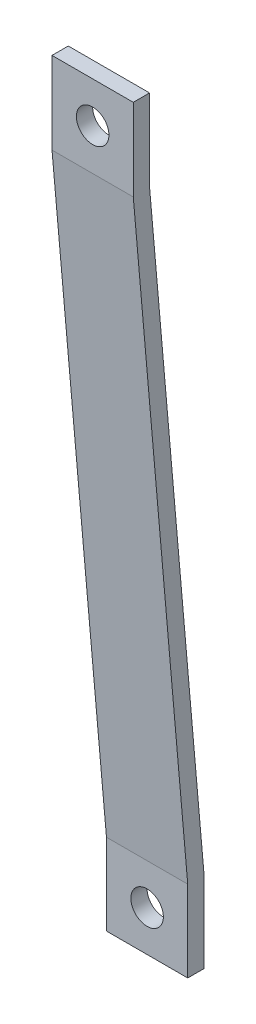
ISO-10303-21;
HEADER;
FILE_DESCRIPTION(('STEP AP214'),'2;1');
FILE_NAME('part.step','',(''),(''),'','','');
FILE_SCHEMA(('AUTOMOTIVE_DESIGN { 1 0 10303 214 1 1 1 1 }'));
ENDSEC;
DATA;
#1=APPLICATION_CONTEXT('core data for automotive mechanical design processes');
#2=APPLICATION_PROTOCOL_DEFINITION('international standard','automotive_design',2000,#1);
#3=PRODUCT_CONTEXT('',#1,'mechanical');
#4=PRODUCT('Part','Part','',(#3));
#5=PRODUCT_RELATED_PRODUCT_CATEGORY('part','',(#4));
#6=PRODUCT_DEFINITION_FORMATION('','',#4);
#7=PRODUCT_DEFINITION_CONTEXT('part definition',#1,'design');
#8=PRODUCT_DEFINITION('design','',#6,#7);
#9=PRODUCT_DEFINITION_SHAPE('','',#8);
#10=(LENGTH_UNIT() NAMED_UNIT(*) SI_UNIT(.MILLI.,.METRE.));
#11=(NAMED_UNIT(*) PLANE_ANGLE_UNIT() SI_UNIT($,.RADIAN.));
#12=(NAMED_UNIT(*) SI_UNIT($,.STERADIAN.) SOLID_ANGLE_UNIT());
#13=UNCERTAINTY_MEASURE_WITH_UNIT(LENGTH_MEASURE(1.E-05),#10,'distance_accuracy_value','');
#14=(GEOMETRIC_REPRESENTATION_CONTEXT(3) GLOBAL_UNCERTAINTY_ASSIGNED_CONTEXT((#13)) GLOBAL_UNIT_ASSIGNED_CONTEXT((#10,
#11,#12)) REPRESENTATION_CONTEXT('',''));
#15=CARTESIAN_POINT('',(0.,0.,0.));
#16=DIRECTION('',(0.,0.,1.));
#17=DIRECTION('',(1.,0.,0.));
#18=AXIS2_PLACEMENT_3D('',#15,#16,#17);
#19=CARTESIAN_POINT('',(15.,0.,3.));
#20=DIRECTION('',(0.,1.,0.));
#21=DIRECTION('',(0.,0.,1.));
#22=AXIS2_PLACEMENT_3D('',#19,#20,#21);
#23=PLANE('',#22);
#24=DIRECTION('',(0.,0.,-1.));
#25=VECTOR('',#24,1.);
#26=CARTESIAN_POINT('',(0.,0.,3.));
#27=LINE('',#26,#25);
#28=CARTESIAN_POINT('',(0.,0.,3.));
#29=VERTEX_POINT('',#28);
#30=CARTESIAN_POINT('',(0.,0.,0.));
#31=VERTEX_POINT('',#30);
#32=EDGE_CURVE('E129',#29,#31,#27,.T.);
#33=ORIENTED_EDGE('',*,*,#32,.T.);
#34=DIRECTION('',(-1.,0.,0.));
#35=VECTOR('',#34,1.);
#36=CARTESIAN_POINT('',(15.,0.,0.));
#37=LINE('',#36,#35);
#38=CARTESIAN_POINT('',(15.,0.,0.));
#39=VERTEX_POINT('',#38);
#40=EDGE_CURVE('E11',#39,#31,#37,.T.);
#41=ORIENTED_EDGE('',*,*,#40,.F.);
#42=DIRECTION('',(0.,0.,-1.));
#43=VECTOR('',#42,1.);
#44=CARTESIAN_POINT('',(15.,0.,3.));
#45=LINE('',#44,#43);
#46=CARTESIAN_POINT('',(15.,0.,3.));
#47=VERTEX_POINT('',#46);
#48=EDGE_CURVE('E144',#47,#39,#45,.T.);
#49=ORIENTED_EDGE('',*,*,#48,.F.);
#50=DIRECTION('',(-1.,0.,0.));
#51=VECTOR('',#50,1.);
#52=CARTESIAN_POINT('',(15.,0.,3.));
#53=LINE('',#52,#51);
#54=EDGE_CURVE('E125',#47,#29,#53,.T.);
#55=ORIENTED_EDGE('',*,*,#54,.T.);
#56=EDGE_LOOP('',(#33,#41,#49,#55));
#57=FACE_BOUND('',#56,.T.);
#58=ADVANCED_FACE('F33',(#57),#23,.F.);
#59=CARTESIAN_POINT('',(15.,15.1309828287255,0.));
#60=DIRECTION('',(0.,0.,1.));
#61=DIRECTION('',(0.,-1.,0.));
#62=AXIS2_PLACEMENT_3D('',#59,#60,#61);
#63=PLANE('',#62);
#64=CARTESIAN_POINT('',(7.5,7.5,0.));
#65=DIRECTION('',(0.,0.,1.));
#66=DIRECTION('',(0.,-1.,0.));
#67=AXIS2_PLACEMENT_3D('',#64,#65,#66);
#68=CIRCLE('',#67,3.);
#69=CARTESIAN_POINT('',(7.5,4.5,0.));
#70=VERTEX_POINT('',#69);
#71=EDGE_CURVE('E133',#70,#70,#68,.F.);
#72=ORIENTED_EDGE('',*,*,#71,.F.);
#73=EDGE_LOOP('',(#72));
#74=FACE_BOUND('',#73,.T.);
#75=DIRECTION('',(0.,1.,0.));
#76=VECTOR('',#75,1.);
#77=CARTESIAN_POINT('',(0.,15.1309828287255,0.));
#78=LINE('',#77,#76);
#79=CARTESIAN_POINT('',(0.,15.1309828287255,0.));
#80=VERTEX_POINT('',#79);
#81=EDGE_CURVE('E132',#31,#80,#78,.T.);
#82=ORIENTED_EDGE('',*,*,#81,.T.);
#83=DIRECTION('',(-1.,0.,0.));
#84=VECTOR('',#83,1.);
#85=CARTESIAN_POINT('',(15.,15.1309828287255,0.));
#86=LINE('',#85,#84);
#87=CARTESIAN_POINT('',(15.,15.1309828287255,0.));
#88=VERTEX_POINT('',#87);
#89=EDGE_CURVE('E41',#88,#80,#86,.T.);
#90=ORIENTED_EDGE('',*,*,#89,.F.);
#91=DIRECTION('',(0.,1.,0.));
#92=VECTOR('',#91,1.);
#93=CARTESIAN_POINT('',(15.,15.1309828287255,0.));
#94=LINE('',#93,#92);
#95=EDGE_CURVE('E92',#39,#88,#94,.T.);
#96=ORIENTED_EDGE('',*,*,#95,.F.);
#97=ORIENTED_EDGE('',*,*,#40,.T.);
#98=EDGE_LOOP('',(#82,#90,#96,#97));
#99=FACE_BOUND('',#98,.T.);
#100=ADVANCED_FACE('F201',(#74,#99),#63,.F.);
#101=CARTESIAN_POINT('',(15.,130.,10.0497367928504));
#102=DIRECTION('',(0.,-0.0871557427476515,0.996194698091746));
#103=DIRECTION('',(0.,-0.996194698091746,-0.0871557427476515));
#104=AXIS2_PLACEMENT_3D('',#101,#102,#103);
#105=PLANE('',#104);
#106=DIRECTION('',(0.,0.996194698091746,0.0871557427476515));
#107=VECTOR('',#106,1.);
#108=CARTESIAN_POINT('',(0.,130.,10.0497367928504));
#109=LINE('',#108,#107);
#110=CARTESIAN_POINT('',(0.,130.,10.0497367928504));
#111=VERTEX_POINT('',#110);
#112=EDGE_CURVE('E135',#80,#111,#109,.T.);
#113=ORIENTED_EDGE('',*,*,#112,.T.);
#114=DIRECTION('',(-1.,0.,0.));
#115=VECTOR('',#114,1.);
#116=CARTESIAN_POINT('',(15.,130.,10.0497367928504));
#117=LINE('',#116,#115);
#118=CARTESIAN_POINT('',(15.,130.,10.0497367928504));
#119=VERTEX_POINT('',#118);
#120=EDGE_CURVE('E151',#119,#111,#117,.T.);
#121=ORIENTED_EDGE('',*,*,#120,.F.);
#122=DIRECTION('',(0.,0.996194698091746,0.0871557427476515));
#123=VECTOR('',#122,1.);
#124=CARTESIAN_POINT('',(15.,130.,10.0497367928504));
#125=LINE('',#124,#123);
#126=EDGE_CURVE('E159',#88,#119,#125,.T.);
#127=ORIENTED_EDGE('',*,*,#126,.F.);
#128=ORIENTED_EDGE('',*,*,#89,.T.);
#129=EDGE_LOOP('',(#113,#121,#127,#128));
#130=FACE_BOUND('',#129,.T.);
#131=ADVANCED_FACE('F157',(#130),#105,.F.);
#132=CARTESIAN_POINT('',(15.,145.,10.0497367928504));
#133=DIRECTION('',(0.,0.,1.));
#134=DIRECTION('',(1.,0.,0.));
#135=AXIS2_PLACEMENT_3D('',#132,#133,#134);
#136=PLANE('',#135);
#137=CARTESIAN_POINT('',(7.5,137.5,10.0497367928504));
#138=DIRECTION('',(0.,0.,1.));
#139=DIRECTION('',(1.,0.,0.));
#140=AXIS2_PLACEMENT_3D('',#137,#138,#139);
#141=CIRCLE('',#140,3.);
#142=CARTESIAN_POINT('',(10.5,137.5,10.0497367928504));
#143=VERTEX_POINT('',#142);
#144=EDGE_CURVE('E182',#143,#143,#141,.F.);
#145=ORIENTED_EDGE('',*,*,#144,.F.);
#146=EDGE_LOOP('',(#145));
#147=FACE_BOUND('',#146,.T.);
#148=DIRECTION('',(0.,1.,0.));
#149=VECTOR('',#148,1.);
#150=CARTESIAN_POINT('',(0.,145.,10.0497367928504));
#151=LINE('',#150,#149);
#152=CARTESIAN_POINT('',(0.,145.,10.0497367928504));
#153=VERTEX_POINT('',#152);
#154=EDGE_CURVE('E137',#111,#153,#151,.T.);
#155=ORIENTED_EDGE('',*,*,#154,.T.);
#156=DIRECTION('',(-1.,0.,0.));
#157=VECTOR('',#156,1.);
#158=CARTESIAN_POINT('',(15.,145.,10.0497367928504));
#159=LINE('',#158,#157);
#160=CARTESIAN_POINT('',(15.,145.,10.0497367928504));
#161=VERTEX_POINT('',#160);
#162=EDGE_CURVE('E148',#161,#153,#159,.T.);
#163=ORIENTED_EDGE('',*,*,#162,.F.);
#164=DIRECTION('',(0.,1.,0.));
#165=VECTOR('',#164,1.);
#166=CARTESIAN_POINT('',(15.,145.,10.0497367928504));
#167=LINE('',#166,#165);
#168=EDGE_CURVE('E171',#119,#161,#167,.T.);
#169=ORIENTED_EDGE('',*,*,#168,.F.);
#170=ORIENTED_EDGE('',*,*,#120,.T.);
#171=EDGE_LOOP('',(#155,#163,#169,#170));
#172=FACE_BOUND('',#171,.T.);
#173=ADVANCED_FACE('F167',(#147,#172),#136,.F.);
#174=CARTESIAN_POINT('',(15.,145.,13.0497367928504));
#175=DIRECTION('',(0.,-1.,0.));
#176=DIRECTION('',(0.,0.,-1.));
#177=AXIS2_PLACEMENT_3D('',#174,#175,#176);
#178=PLANE('',#177);
#179=DIRECTION('',(0.,0.,1.));
#180=VECTOR('',#179,1.);
#181=CARTESIAN_POINT('',(0.,145.,13.0497367928504));
#182=LINE('',#181,#180);
#183=CARTESIAN_POINT('',(0.,145.,13.0497367928504));
#184=VERTEX_POINT('',#183);
#185=EDGE_CURVE('E139',#153,#184,#182,.T.);
#186=ORIENTED_EDGE('',*,*,#185,.T.);
#187=DIRECTION('',(-1.,0.,0.));
#188=VECTOR('',#187,1.);
#189=CARTESIAN_POINT('',(15.,145.,13.0497367928504));
#190=LINE('',#189,#188);
#191=CARTESIAN_POINT('',(15.,145.,13.0497367928504));
#192=VERTEX_POINT('',#191);
#193=EDGE_CURVE('E120',#192,#184,#190,.T.);
#194=ORIENTED_EDGE('',*,*,#193,.F.);
#195=DIRECTION('',(0.,0.,1.));
#196=VECTOR('',#195,1.);
#197=CARTESIAN_POINT('',(15.,145.,13.0497367928504));
#198=LINE('',#197,#196);
#199=EDGE_CURVE('E111',#161,#192,#198,.T.);
#200=ORIENTED_EDGE('',*,*,#199,.F.);
#201=ORIENTED_EDGE('',*,*,#162,.T.);
#202=EDGE_LOOP('',(#186,#194,#200,#201));
#203=FACE_BOUND('',#202,.T.);
#204=ADVANCED_FACE('F170',(#203),#178,.F.);
#205=CARTESIAN_POINT('',(15.,145.,13.0497367928504));
#206=DIRECTION('',(0.,0.,-1.));
#207=DIRECTION('',(0.,1.,0.));
#208=AXIS2_PLACEMENT_3D('',#205,#206,#207);
#209=PLANE('',#208);
#210=CARTESIAN_POINT('',(7.5,137.5,13.0497367928504));
#211=DIRECTION('',(0.,0.,1.));
#212=DIRECTION('',(1.,0.,0.));
#213=AXIS2_PLACEMENT_3D('',#210,#211,#212);
#214=CIRCLE('',#213,3.);
#215=CARTESIAN_POINT('',(10.5,137.5,13.0497367928504));
#216=VERTEX_POINT('',#215);
#217=EDGE_CURVE('E185',#216,#216,#214,.T.);
#218=ORIENTED_EDGE('',*,*,#217,.F.);
#219=EDGE_LOOP('',(#218));
#220=FACE_BOUND('',#219,.T.);
#221=DIRECTION('',(0.,-1.,0.));
#222=VECTOR('',#221,1.);
#223=CARTESIAN_POINT('',(0.,145.,13.0497367928504));
#224=LINE('',#223,#222);
#225=CARTESIAN_POINT('',(0.,129.869017171274,13.0497367928504));
#226=VERTEX_POINT('',#225);
#227=EDGE_CURVE('E119',#184,#226,#224,.T.);
#228=ORIENTED_EDGE('',*,*,#227,.T.);
#229=DIRECTION('',(-1.,0.,0.));
#230=VECTOR('',#229,1.);
#231=CARTESIAN_POINT('',(15.,129.869017171274,13.0497367928504));
#232=LINE('',#231,#230);
#233=CARTESIAN_POINT('',(15.,129.869017171274,13.0497367928504));
#234=VERTEX_POINT('',#233);
#235=EDGE_CURVE('E116',#234,#226,#232,.T.);
#236=ORIENTED_EDGE('',*,*,#235,.F.);
#237=DIRECTION('',(0.,-1.,0.));
#238=VECTOR('',#237,1.);
#239=CARTESIAN_POINT('',(15.,145.,13.0497367928504));
#240=LINE('',#239,#238);
#241=EDGE_CURVE('E105',#192,#234,#240,.T.);
#242=ORIENTED_EDGE('',*,*,#241,.F.);
#243=ORIENTED_EDGE('',*,*,#193,.T.);
#244=EDGE_LOOP('',(#228,#236,#242,#243));
#245=FACE_BOUND('',#244,.T.);
#246=ADVANCED_FACE('F117',(#220,#245),#209,.F.);
#247=CARTESIAN_POINT('',(15.,129.869017171274,13.0497367928504));
#248=DIRECTION('',(0.,0.0871557427476515,-0.996194698091746));
#249=DIRECTION('',(0.,0.996194698091746,0.0871557427476515));
#250=AXIS2_PLACEMENT_3D('',#247,#248,#249);
#251=PLANE('',#250);
#252=DIRECTION('',(0.,-0.996194698091746,-0.0871557427476515));
#253=VECTOR('',#252,1.);
#254=CARTESIAN_POINT('',(0.,129.869017171274,13.0497367928504));
#255=LINE('',#254,#253);
#256=CARTESIAN_POINT('',(0.,15.,3.));
#257=VERTEX_POINT('',#256);
#258=EDGE_CURVE('E78',#226,#257,#255,.T.);
#259=ORIENTED_EDGE('',*,*,#258,.T.);
#260=DIRECTION('',(-1.,0.,0.));
#261=VECTOR('',#260,1.);
#262=CARTESIAN_POINT('',(15.,15.,3.));
#263=LINE('',#262,#261);
#264=CARTESIAN_POINT('',(15.,15.,3.));
#265=VERTEX_POINT('',#264);
#266=EDGE_CURVE('E121',#265,#257,#263,.T.);
#267=ORIENTED_EDGE('',*,*,#266,.F.);
#268=DIRECTION('',(0.,-0.996194698091746,-0.0871557427476515));
#269=VECTOR('',#268,1.);
#270=CARTESIAN_POINT('',(15.,129.869017171274,13.0497367928504));
#271=LINE('',#270,#269);
#272=EDGE_CURVE('E109',#234,#265,#271,.T.);
#273=ORIENTED_EDGE('',*,*,#272,.F.);
#274=ORIENTED_EDGE('',*,*,#235,.T.);
#275=EDGE_LOOP('',(#259,#267,#273,#274));
#276=FACE_BOUND('',#275,.T.);
#277=ADVANCED_FACE('F123',(#276),#251,.F.);
#278=CARTESIAN_POINT('',(15.,15.,3.));
#279=DIRECTION('',(0.,0.,-1.));
#280=DIRECTION('',(0.,1.,0.));
#281=AXIS2_PLACEMENT_3D('',#278,#279,#280);
#282=PLANE('',#281);
#283=CARTESIAN_POINT('',(7.5,7.5,3.));
#284=DIRECTION('',(0.,0.,1.));
#285=DIRECTION('',(1.,0.,0.));
#286=AXIS2_PLACEMENT_3D('',#283,#284,#285);
#287=CIRCLE('',#286,3.);
#288=CARTESIAN_POINT('',(10.5,7.5,3.));
#289=VERTEX_POINT('',#288);
#290=EDGE_CURVE('E179',#289,#289,#287,.T.);
#291=ORIENTED_EDGE('',*,*,#290,.F.);
#292=EDGE_LOOP('',(#291));
#293=FACE_BOUND('',#292,.T.);
#294=DIRECTION('',(0.,-1.,0.));
#295=VECTOR('',#294,1.);
#296=CARTESIAN_POINT('',(0.,15.,3.));
#297=LINE('',#296,#295);
#298=EDGE_CURVE('E84',#257,#29,#297,.T.);
#299=ORIENTED_EDGE('',*,*,#298,.T.);
#300=ORIENTED_EDGE('',*,*,#54,.F.);
#301=DIRECTION('',(0.,-1.,0.));
#302=VECTOR('',#301,1.);
#303=CARTESIAN_POINT('',(15.,15.,3.));
#304=LINE('',#303,#302);
#305=EDGE_CURVE('E49',#265,#47,#304,.T.);
#306=ORIENTED_EDGE('',*,*,#305,.F.);
#307=ORIENTED_EDGE('',*,*,#266,.T.);
#308=EDGE_LOOP('',(#299,#300,#306,#307));
#309=FACE_BOUND('',#308,.T.);
#310=ADVANCED_FACE('F197',(#293,#309),#282,.F.);
#311=CARTESIAN_POINT('',(15.,0.,0.));
#312=DIRECTION('',(-1.,0.,0.));
#313=DIRECTION('',(0.,0.,1.));
#314=AXIS2_PLACEMENT_3D('',#311,#312,#313);
#315=PLANE('',#314);
#316=ORIENTED_EDGE('',*,*,#48,.T.);
#317=ORIENTED_EDGE('',*,*,#95,.T.);
#318=ORIENTED_EDGE('',*,*,#126,.T.);
#319=ORIENTED_EDGE('',*,*,#168,.T.);
#320=ORIENTED_EDGE('',*,*,#199,.T.);
#321=ORIENTED_EDGE('',*,*,#241,.T.);
#322=ORIENTED_EDGE('',*,*,#272,.T.);
#323=ORIENTED_EDGE('',*,*,#305,.T.);
#324=EDGE_LOOP('',(#316,#317,#318,#319,#320,#321,#322,#323));
#325=FACE_BOUND('',#324,.T.);
#326=ADVANCED_FACE('F107',(#325),#315,.F.);
#327=CARTESIAN_POINT('',(0.,0.,0.));
#328=DIRECTION('',(-1.,0.,0.));
#329=DIRECTION('',(0.,0.,1.));
#330=AXIS2_PLACEMENT_3D('',#327,#328,#329);
#331=PLANE('',#330);
#332=ORIENTED_EDGE('',*,*,#32,.F.);
#333=ORIENTED_EDGE('',*,*,#298,.F.);
#334=ORIENTED_EDGE('',*,*,#258,.F.);
#335=ORIENTED_EDGE('',*,*,#227,.F.);
#336=ORIENTED_EDGE('',*,*,#185,.F.);
#337=ORIENTED_EDGE('',*,*,#154,.F.);
#338=ORIENTED_EDGE('',*,*,#112,.F.);
#339=ORIENTED_EDGE('',*,*,#81,.F.);
#340=EDGE_LOOP('',(#332,#333,#334,#335,#336,#337,#338,#339));
#341=FACE_BOUND('',#340,.T.);
#342=ADVANCED_FACE('F163',(#341),#331,.T.);
#343=CARTESIAN_POINT('',(7.5,7.5,-8.48528137423857));
#344=DIRECTION('',(0.,0.,1.));
#345=DIRECTION('',(1.,0.,0.));
#346=AXIS2_PLACEMENT_3D('',#343,#344,#345);
#347=CYLINDRICAL_SURFACE('',#346,3.);
#348=ORIENTED_EDGE('',*,*,#71,.T.);
#349=EDGE_LOOP('',(#348));
#350=FACE_BOUND('',#349,.T.);
#351=ORIENTED_EDGE('',*,*,#290,.T.);
#352=EDGE_LOOP('',(#351));
#353=FACE_BOUND('',#352,.T.);
#354=ADVANCED_FACE('F219',(#350,#353),#347,.F.);
#355=CARTESIAN_POINT('',(7.5,137.5,1.56445541861187));
#356=DIRECTION('',(0.,0.,1.));
#357=DIRECTION('',(1.,0.,0.));
#358=AXIS2_PLACEMENT_3D('',#355,#356,#357);
#359=CYLINDRICAL_SURFACE('',#358,3.);
#360=CARTESIAN_POINT('',(10.5,137.5,10.0497367928504));
#361=CARTESIAN_POINT('',(10.5,137.5,10.0809867928504));
#362=CARTESIAN_POINT('',(10.5,137.5,10.1122367928504));
#363=CARTESIAN_POINT('',(10.5,137.5,10.1747367928504));
#364=CARTESIAN_POINT('',(10.5,137.5,10.2059867928504));
#365=CARTESIAN_POINT('',(10.5,137.5,10.2684867928504));
#366=CARTESIAN_POINT('',(10.5,137.5,10.2997367928504));
#367=CARTESIAN_POINT('',(10.5,137.5,10.3622367928504));
#368=CARTESIAN_POINT('',(10.5,137.5,10.3934867928504));
#369=CARTESIAN_POINT('',(10.5,137.5,10.4559867928504));
#370=CARTESIAN_POINT('',(10.5,137.5,10.4872367928504));
#371=CARTESIAN_POINT('',(10.5,137.5,10.5497367928504));
#372=CARTESIAN_POINT('',(10.5,137.5,10.5809867928504));
#373=CARTESIAN_POINT('',(10.5,137.5,10.6434867928504));
#374=CARTESIAN_POINT('',(10.5,137.5,10.6747367928504));
#375=CARTESIAN_POINT('',(10.5,137.5,10.7372367928504));
#376=CARTESIAN_POINT('',(10.5,137.5,10.7684867928504));
#377=CARTESIAN_POINT('',(10.5,137.5,10.8309867928504));
#378=CARTESIAN_POINT('',(10.5,137.5,10.8622367928504));
#379=CARTESIAN_POINT('',(10.5,137.5,10.9247367928504));
#380=CARTESIAN_POINT('',(10.5,137.5,10.9559867928504));
#381=CARTESIAN_POINT('',(10.5,137.5,11.0184867928504));
#382=CARTESIAN_POINT('',(10.5,137.5,11.0497367928504));
#383=CARTESIAN_POINT('',(10.5,137.5,11.1122367928504));
#384=CARTESIAN_POINT('',(10.5,137.5,11.1434867928504));
#385=CARTESIAN_POINT('',(10.5,137.5,11.2059867928504));
#386=CARTESIAN_POINT('',(10.5,137.5,11.2372367928504));
#387=CARTESIAN_POINT('',(10.5,137.5,11.2997367928504));
#388=CARTESIAN_POINT('',(10.5,137.5,11.3309867928504));
#389=CARTESIAN_POINT('',(10.5,137.5,11.3934867928504));
#390=CARTESIAN_POINT('',(10.5,137.5,11.4247367928504));
#391=CARTESIAN_POINT('',(10.5,137.5,11.4872367928504));
#392=CARTESIAN_POINT('',(10.5,137.5,11.5184867928504));
#393=CARTESIAN_POINT('',(10.5,137.5,11.5809867928504));
#394=CARTESIAN_POINT('',(10.5,137.5,11.6122367928504));
#395=CARTESIAN_POINT('',(10.5,137.5,11.6747367928504));
#396=CARTESIAN_POINT('',(10.5,137.5,11.7059867928504));
#397=CARTESIAN_POINT('',(10.5,137.5,11.7684867928504));
#398=CARTESIAN_POINT('',(10.5,137.5,11.7997367928504));
#399=CARTESIAN_POINT('',(10.5,137.5,11.8622367928504));
#400=CARTESIAN_POINT('',(10.5,137.5,11.8934867928504));
#401=CARTESIAN_POINT('',(10.5,137.5,11.9559867928504));
#402=CARTESIAN_POINT('',(10.5,137.5,11.9872367928504));
#403=CARTESIAN_POINT('',(10.5,137.5,12.0497367928504));
#404=CARTESIAN_POINT('',(10.5,137.5,12.0809867928504));
#405=CARTESIAN_POINT('',(10.5,137.5,12.1434867928504));
#406=CARTESIAN_POINT('',(10.5,137.5,12.1747367928504));
#407=CARTESIAN_POINT('',(10.5,137.5,12.2372367928504));
#408=CARTESIAN_POINT('',(10.5,137.5,12.2684867928504));
#409=CARTESIAN_POINT('',(10.5,137.5,12.3309867928504));
#410=CARTESIAN_POINT('',(10.5,137.5,12.3622367928504));
#411=CARTESIAN_POINT('',(10.5,137.5,12.4247367928504));
#412=CARTESIAN_POINT('',(10.5,137.5,12.4559867928504));
#413=CARTESIAN_POINT('',(10.5,137.5,12.5184867928504));
#414=CARTESIAN_POINT('',(10.5,137.5,12.5497367928504));
#415=CARTESIAN_POINT('',(10.5,137.5,12.6122367928504));
#416=CARTESIAN_POINT('',(10.5,137.5,12.6434867928504));
#417=CARTESIAN_POINT('',(10.5,137.5,12.7059867928504));
#418=CARTESIAN_POINT('',(10.5,137.5,12.7372367928504));
#419=CARTESIAN_POINT('',(10.5,137.5,12.7997367928504));
#420=CARTESIAN_POINT('',(10.5,137.5,12.8309867928504));
#421=CARTESIAN_POINT('',(10.5,137.5,12.8934867928504));
#422=CARTESIAN_POINT('',(10.5,137.5,12.9247367928504));
#423=CARTESIAN_POINT('',(10.5,137.5,12.9872367928504));
#424=CARTESIAN_POINT('',(10.5,137.5,13.0184867928504));
#425=CARTESIAN_POINT('',(10.5,137.5,13.0497367928504));
#426=B_SPLINE_CURVE_WITH_KNOTS('',3,(#360,#361,#362,#363,#364,#365,#366,#367,#368,#369,#370,
#371,#372,#373,#374,#375,#376,#377,#378,#379,#380,#381,#382,#383,#384,#385,#386,#387,#388,#389,
#390,#391,#392,#393,#394,#395,#396,#397,#398,#399,#400,#401,#402,#403,#404,#405,#406,#407,#408,
#409,#410,#411,#412,#413,#414,#415,#416,#417,#418,#419,#420,#421,#422,#423,#424,#425),
.UNSPECIFIED.,.F.,.F.,(4,2,2,2,2,2,2,2,2,2,2,2,2,2,2,2,2,2,2,2,2,2,2,2,2,2,2,2,2,2,2,2,4),(0.,
0.0937500000000001,0.187499999999998,0.281249999999999,0.374999999999997,0.468749999999997,
0.562499999999997,0.656249999999995,0.749999999999995,0.843749999999996,0.937499999999994,
1.03124999999999,1.12499999999999,1.21874999999999,1.31249999999999,1.40624999999999,
1.49999999999999,1.59374999999999,1.68749999999999,1.78124999999999,1.87499999999999,
1.96874999999999,2.06249999999999,2.15624999999999,2.24999999999999,2.34374999999998,
2.43749999999998,2.53124999999998,2.62499999999998,2.71874999999998,2.81249999999998,
2.90624999999998,2.99999999999998),.UNSPECIFIED.);
#427=EDGE_CURVE('BSEAM189',#143,#216,#426,.T.);
#428=ORIENTED_EDGE('',*,*,#144,.T.);
#429=ORIENTED_EDGE('',*,*,#217,.T.);
#430=ORIENTED_EDGE('',*,*,#427,.T.);
#431=ORIENTED_EDGE('',*,*,#427,.F.);
#432=EDGE_LOOP('',(#428,#430,#429,#431));
#433=FACE_BOUND('',#432,.T.);
#434=ADVANCED_FACE('F189',(#433),#359,.F.);
#435=CLOSED_SHELL('',(#58,#100,#131,#173,#204,#246,#277,#310,#326,#342,#354,#434));
#436=MANIFOLD_SOLID_BREP('B2',#435);
#437=ADVANCED_BREP_SHAPE_REPRESENTATION('',(#18,#436),#14);
#438=SHAPE_DEFINITION_REPRESENTATION(#9,#437);
ENDSEC;
END-ISO-10303-21;
